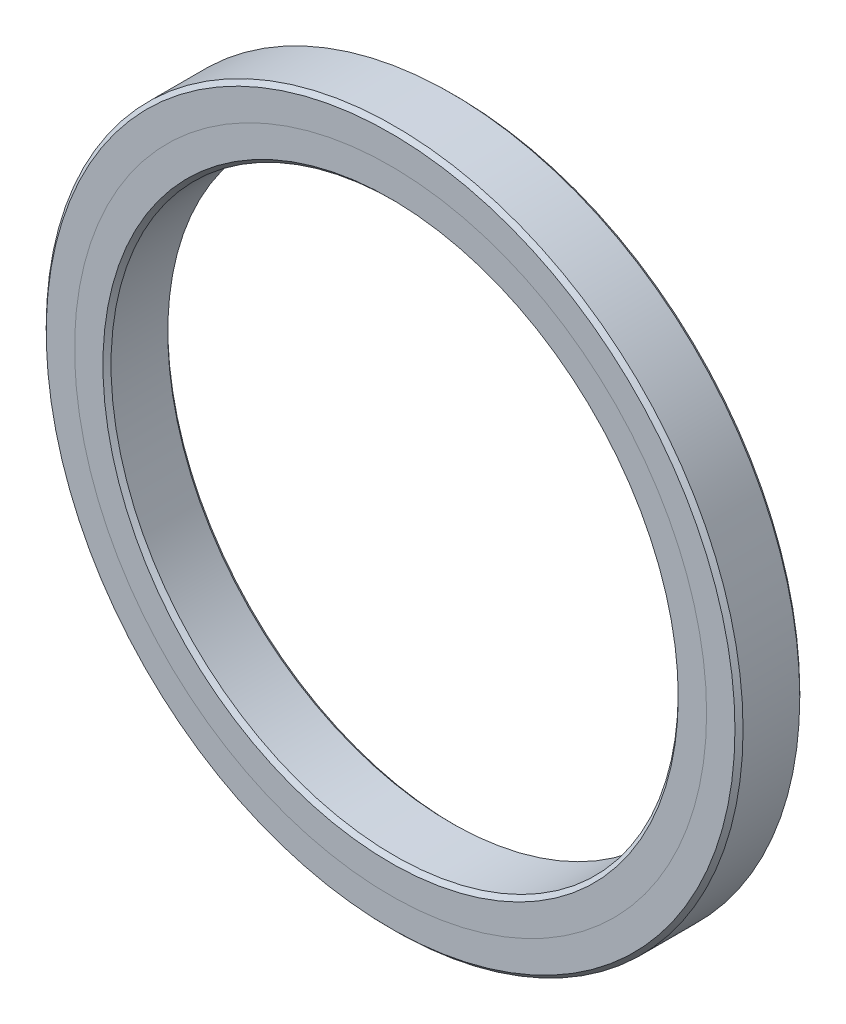
ISO-10303-21;
HEADER;
FILE_DESCRIPTION(('STEP AP214'),'2;1');
FILE_NAME('part.step','',(''),(''),'','','');
FILE_SCHEMA(('AUTOMOTIVE_DESIGN { 1 0 10303 214 1 1 1 1 }'));
ENDSEC;
DATA;
#1=APPLICATION_CONTEXT('core data for automotive mechanical design processes');
#2=APPLICATION_PROTOCOL_DEFINITION('international standard','automotive_design',2000,#1);
#3=PRODUCT_CONTEXT('',#1,'mechanical');
#4=PRODUCT('Part','Part','',(#3));
#5=PRODUCT_RELATED_PRODUCT_CATEGORY('part','',(#4));
#6=PRODUCT_DEFINITION_FORMATION('','',#4);
#7=PRODUCT_DEFINITION_CONTEXT('part definition',#1,'design');
#8=PRODUCT_DEFINITION('design','',#6,#7);
#9=PRODUCT_DEFINITION_SHAPE('','',#8);
#10=(LENGTH_UNIT() NAMED_UNIT(*) SI_UNIT(.MILLI.,.METRE.));
#11=(NAMED_UNIT(*) PLANE_ANGLE_UNIT() SI_UNIT($,.RADIAN.));
#12=(NAMED_UNIT(*) SI_UNIT($,.STERADIAN.) SOLID_ANGLE_UNIT());
#13=UNCERTAINTY_MEASURE_WITH_UNIT(LENGTH_MEASURE(1.E-05),#10,'distance_accuracy_value','');
#14=(GEOMETRIC_REPRESENTATION_CONTEXT(3) GLOBAL_UNCERTAINTY_ASSIGNED_CONTEXT((#13)) GLOBAL_UNIT_ASSIGNED_CONTEXT((#10,
#11,#12)) REPRESENTATION_CONTEXT('',''));
#15=CARTESIAN_POINT('',(0.,0.,0.));
#16=DIRECTION('',(0.,0.,1.));
#17=DIRECTION('',(1.,0.,0.));
#18=AXIS2_PLACEMENT_3D('',#15,#16,#17);
#19=CARTESIAN_POINT('',(0.,0.,-4.));
#20=DIRECTION('',(0.,0.,1.));
#21=DIRECTION('',(1.,0.,0.));
#22=AXIS2_PLACEMENT_3D('',#19,#20,#21);
#23=PLANE('',#22);
#24=CARTESIAN_POINT('',(0.,0.,-4.));
#25=DIRECTION('',(0.,0.,1.));
#26=DIRECTION('',(1.,0.,0.));
#27=AXIS2_PLACEMENT_3D('',#24,#25,#26);
#28=CIRCLE('',#27,42.5);
#29=CARTESIAN_POINT('',(42.5,0.,-4.));
#30=VERTEX_POINT('',#29);
#31=EDGE_CURVE('E58',#30,#30,#28,.F.);
#32=ORIENTED_EDGE('',*,*,#31,.T.);
#33=EDGE_LOOP('',(#32));
#34=FACE_BOUND('',#33,.T.);
#35=CARTESIAN_POINT('',(0.,0.,-4.));
#36=DIRECTION('',(0.,0.,1.));
#37=DIRECTION('',(1.,0.,0.));
#38=AXIS2_PLACEMENT_3D('',#35,#36,#37);
#39=CIRCLE('',#38,39.);
#40=CARTESIAN_POINT('',(39.,0.,-4.));
#41=VERTEX_POINT('',#40);
#42=EDGE_CURVE('E10',#41,#41,#39,.F.);
#43=ORIENTED_EDGE('',*,*,#42,.F.);
#44=EDGE_LOOP('',(#43));
#45=FACE_BOUND('',#44,.T.);
#46=ADVANCED_FACE('F38',(#34,#45),#23,.F.);
#47=CARTESIAN_POINT('',(0.,0.,4.));
#48=DIRECTION('',(0.,0.,1.));
#49=DIRECTION('',(1.,0.,0.));
#50=AXIS2_PLACEMENT_3D('',#47,#48,#49);
#51=PLANE('',#50);
#52=CARTESIAN_POINT('',(0.,0.,4.));
#53=DIRECTION('',(0.,0.,1.));
#54=DIRECTION('',(1.,0.,0.));
#55=AXIS2_PLACEMENT_3D('',#52,#53,#54);
#56=CIRCLE('',#55,42.5);
#57=CARTESIAN_POINT('',(42.5,0.,4.));
#58=VERTEX_POINT('',#57);
#59=EDGE_CURVE('E70',#58,#58,#56,.T.);
#60=ORIENTED_EDGE('',*,*,#59,.T.);
#61=EDGE_LOOP('',(#60));
#62=FACE_BOUND('',#61,.T.);
#63=CARTESIAN_POINT('',(0.,0.,4.));
#64=DIRECTION('',(0.,0.,1.));
#65=DIRECTION('',(1.,0.,0.));
#66=AXIS2_PLACEMENT_3D('',#63,#64,#65);
#67=CIRCLE('',#66,39.);
#68=CARTESIAN_POINT('',(39.,0.,4.));
#69=VERTEX_POINT('',#68);
#70=EDGE_CURVE('E43',#69,#69,#67,.F.);
#71=ORIENTED_EDGE('',*,*,#70,.T.);
#72=EDGE_LOOP('',(#71));
#73=FACE_BOUND('',#72,.T.);
#74=ADVANCED_FACE('F99',(#62,#73),#51,.T.);
#75=ORIENTED_EDGE('',*,*,#70,.F.);
#76=EDGE_LOOP('',(#75));
#77=FACE_BOUND('',#76,.T.);
#78=CARTESIAN_POINT('',(0.,0.,4.));
#79=DIRECTION('',(0.,0.,1.));
#80=DIRECTION('',(1.,0.,0.));
#81=AXIS2_PLACEMENT_3D('',#78,#79,#80);
#82=CIRCLE('',#81,35.5);
#83=CARTESIAN_POINT('',(35.5,0.,4.));
#84=VERTEX_POINT('',#83);
#85=EDGE_CURVE('E67',#84,#84,#82,.F.);
#86=ORIENTED_EDGE('',*,*,#85,.T.);
#87=EDGE_LOOP('',(#86));
#88=FACE_BOUND('',#87,.T.);
#89=ADVANCED_FACE('F91',(#77,#88),#51,.T.);
#90=ORIENTED_EDGE('',*,*,#42,.T.);
#91=EDGE_LOOP('',(#90));
#92=FACE_BOUND('',#91,.T.);
#93=CARTESIAN_POINT('',(0.,0.,-4.));
#94=DIRECTION('',(0.,0.,1.));
#95=DIRECTION('',(1.,0.,0.));
#96=AXIS2_PLACEMENT_3D('',#93,#94,#95);
#97=CIRCLE('',#96,35.5);
#98=CARTESIAN_POINT('',(35.5,0.,-4.));
#99=VERTEX_POINT('',#98);
#100=EDGE_CURVE('E54',#99,#99,#97,.T.);
#101=ORIENTED_EDGE('',*,*,#100,.T.);
#102=EDGE_LOOP('',(#101));
#103=FACE_BOUND('',#102,.T.);
#104=ADVANCED_FACE('F88',(#92,#103),#23,.F.);
#105=CARTESIAN_POINT('',(0.,0.,4.));
#106=DIRECTION('',(0.,0.,-1.));
#107=DIRECTION('',(-1.,0.,0.));
#108=AXIS2_PLACEMENT_3D('',#105,#106,#107);
#109=CYLINDRICAL_SURFACE('',#108,43.);
#110=CARTESIAN_POINT('',(0.,0.,3.49999999999999));
#111=DIRECTION('',(0.,0.,1.));
#112=DIRECTION('',(1.,0.,0.));
#113=AXIS2_PLACEMENT_3D('',#110,#111,#112);
#114=CIRCLE('',#113,43.);
#115=CARTESIAN_POINT('',(43.,0.,3.49999999999999));
#116=VERTEX_POINT('',#115);
#117=EDGE_CURVE('E61',#116,#116,#114,.F.);
#118=ORIENTED_EDGE('',*,*,#117,.T.);
#119=EDGE_LOOP('',(#118));
#120=FACE_BOUND('',#119,.T.);
#121=CARTESIAN_POINT('',(0.,0.,-3.49999999999999));
#122=DIRECTION('',(0.,0.,1.));
#123=DIRECTION('',(1.,0.,0.));
#124=AXIS2_PLACEMENT_3D('',#121,#122,#123);
#125=CIRCLE('',#124,43.);
#126=CARTESIAN_POINT('',(43.,0.,-3.49999999999999));
#127=VERTEX_POINT('',#126);
#128=EDGE_CURVE('E64',#127,#127,#125,.T.);
#129=ORIENTED_EDGE('',*,*,#128,.T.);
#130=EDGE_LOOP('',(#129));
#131=FACE_BOUND('',#130,.T.);
#132=ADVANCED_FACE('F90',(#120,#131),#109,.T.);
#133=CARTESIAN_POINT('',(0.,0.,4.));
#134=DIRECTION('',(0.,0.,-1.));
#135=DIRECTION('',(-1.,0.,0.));
#136=AXIS2_PLACEMENT_3D('',#133,#134,#135);
#137=CYLINDRICAL_SURFACE('',#136,35.);
#138=CARTESIAN_POINT('',(0.,0.,3.5));
#139=DIRECTION('',(0.,0.,1.));
#140=DIRECTION('',(1.,0.,0.));
#141=AXIS2_PLACEMENT_3D('',#138,#139,#140);
#142=CIRCLE('',#141,35.);
#143=CARTESIAN_POINT('',(35.,0.,3.5));
#144=VERTEX_POINT('',#143);
#145=EDGE_CURVE('E73',#144,#144,#142,.T.);
#146=ORIENTED_EDGE('',*,*,#145,.T.);
#147=EDGE_LOOP('',(#146));
#148=FACE_BOUND('',#147,.T.);
#149=CARTESIAN_POINT('',(0.,0.,-3.50000000000001));
#150=DIRECTION('',(0.,0.,1.));
#151=DIRECTION('',(1.,0.,0.));
#152=AXIS2_PLACEMENT_3D('',#149,#150,#151);
#153=CIRCLE('',#152,35.);
#154=CARTESIAN_POINT('',(35.,0.,-3.50000000000001));
#155=VERTEX_POINT('',#154);
#156=EDGE_CURVE('E76',#155,#155,#153,.F.);
#157=ORIENTED_EDGE('',*,*,#156,.T.);
#158=EDGE_LOOP('',(#157));
#159=FACE_BOUND('',#158,.T.);
#160=ADVANCED_FACE('F80',(#148,#159),#137,.F.);
#161=CARTESIAN_POINT('',(0.,0.,3.5));
#162=DIRECTION('',(0.,0.,1.));
#163=DIRECTION('',(1.,0.,0.));
#164=AXIS2_PLACEMENT_3D('',#161,#162,#163);
#165=CONICAL_SURFACE('',#164,35.,0.785398163397441);
#166=ORIENTED_EDGE('',*,*,#85,.F.);
#167=EDGE_LOOP('',(#166));
#168=FACE_BOUND('',#167,.T.);
#169=ORIENTED_EDGE('',*,*,#145,.F.);
#170=EDGE_LOOP('',(#169));
#171=FACE_BOUND('',#170,.T.);
#172=ADVANCED_FACE('F127',(#168,#171),#165,.F.);
#173=CARTESIAN_POINT('',(0.,0.,4.));
#174=DIRECTION('',(0.,0.,-1.));
#175=DIRECTION('',(-1.,0.,0.));
#176=AXIS2_PLACEMENT_3D('',#173,#174,#175);
#177=CONICAL_SURFACE('',#176,42.5,0.785398163397414);
#178=ORIENTED_EDGE('',*,*,#117,.F.);
#179=EDGE_LOOP('',(#178));
#180=FACE_BOUND('',#179,.T.);
#181=ORIENTED_EDGE('',*,*,#59,.F.);
#182=EDGE_LOOP('',(#181));
#183=FACE_BOUND('',#182,.T.);
#184=ADVANCED_FACE('F85',(#180,#183),#177,.T.);
#185=CARTESIAN_POINT('',(0.,0.,-4.));
#186=DIRECTION('',(0.,0.,-1.));
#187=DIRECTION('',(-1.,0.,0.));
#188=AXIS2_PLACEMENT_3D('',#185,#186,#187);
#189=CONICAL_SURFACE('',#188,35.5,0.785398163397441);
#190=ORIENTED_EDGE('',*,*,#156,.F.);
#191=EDGE_LOOP('',(#190));
#192=FACE_BOUND('',#191,.T.);
#193=ORIENTED_EDGE('',*,*,#100,.F.);
#194=EDGE_LOOP('',(#193));
#195=FACE_BOUND('',#194,.T.);
#196=ADVANCED_FACE('F82',(#192,#195),#189,.F.);
#197=CARTESIAN_POINT('',(0.,0.,-3.49999999999999));
#198=DIRECTION('',(0.,0.,1.));
#199=DIRECTION('',(1.,0.,0.));
#200=AXIS2_PLACEMENT_3D('',#197,#198,#199);
#201=CONICAL_SURFACE('',#200,43.,0.785398163397441);
#202=ORIENTED_EDGE('',*,*,#31,.F.);
#203=EDGE_LOOP('',(#202));
#204=FACE_BOUND('',#203,.T.);
#205=ORIENTED_EDGE('',*,*,#128,.F.);
#206=EDGE_LOOP('',(#205));
#207=FACE_BOUND('',#206,.T.);
#208=ADVANCED_FACE('F41',(#204,#207),#201,.T.);
#209=CLOSED_SHELL('',(#46,#74,#89,#104,#132,#160,#172,#184,#196,#208));
#210=MANIFOLD_SOLID_BREP('B2',#209);
#211=ADVANCED_BREP_SHAPE_REPRESENTATION('',(#18,#210),#14);
#212=SHAPE_DEFINITION_REPRESENTATION(#9,#211);
ENDSEC;
END-ISO-10303-21;
